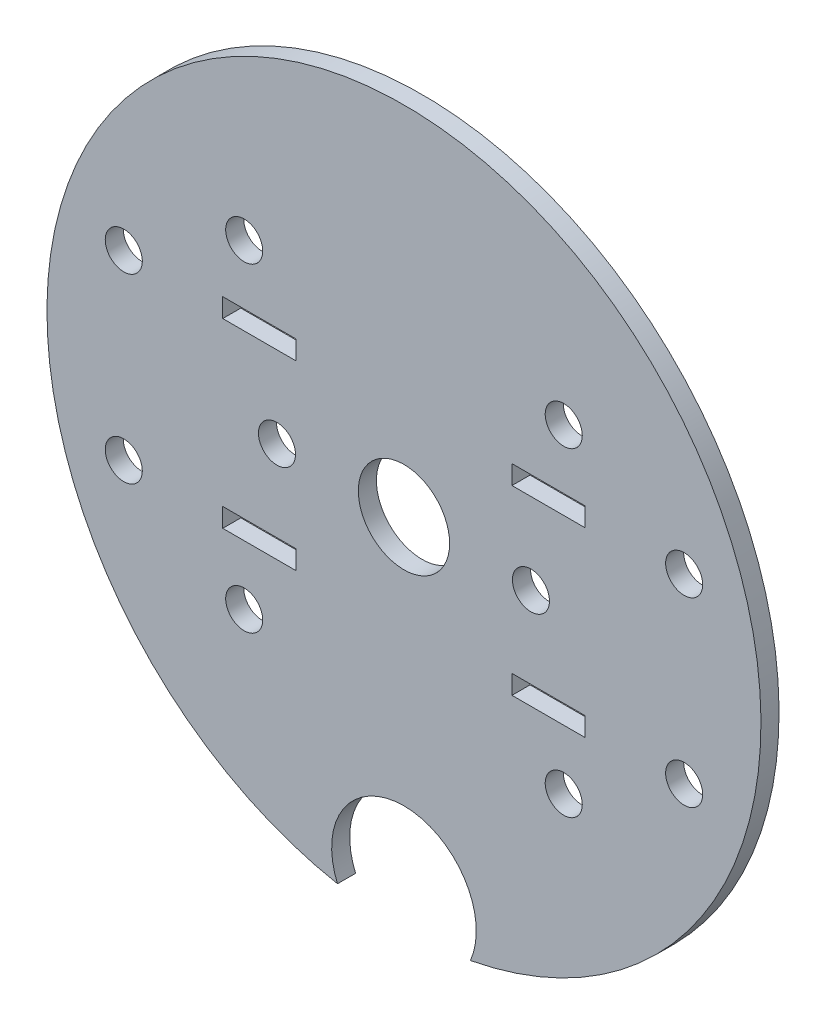
ISO-10303-21;
HEADER;
FILE_DESCRIPTION(('STEP AP214'),'2;1');
FILE_NAME('part.step','',(''),(''),'','','');
FILE_SCHEMA(('AUTOMOTIVE_DESIGN { 1 0 10303 214 1 1 1 1 }'));
ENDSEC;
DATA;
#1=APPLICATION_CONTEXT('core data for automotive mechanical design processes');
#2=APPLICATION_PROTOCOL_DEFINITION('international standard','automotive_design',2000,#1);
#3=PRODUCT_CONTEXT('',#1,'mechanical');
#4=PRODUCT('Part','Part','',(#3));
#5=PRODUCT_RELATED_PRODUCT_CATEGORY('part','',(#4));
#6=PRODUCT_DEFINITION_FORMATION('','',#4);
#7=PRODUCT_DEFINITION_CONTEXT('part definition',#1,'design');
#8=PRODUCT_DEFINITION('design','',#6,#7);
#9=PRODUCT_DEFINITION_SHAPE('','',#8);
#10=(LENGTH_UNIT() NAMED_UNIT(*) SI_UNIT(.MILLI.,.METRE.));
#11=(NAMED_UNIT(*) PLANE_ANGLE_UNIT() SI_UNIT($,.RADIAN.));
#12=(NAMED_UNIT(*) SI_UNIT($,.STERADIAN.) SOLID_ANGLE_UNIT());
#13=UNCERTAINTY_MEASURE_WITH_UNIT(LENGTH_MEASURE(1.E-05),#10,'distance_accuracy_value','');
#14=(GEOMETRIC_REPRESENTATION_CONTEXT(3) GLOBAL_UNCERTAINTY_ASSIGNED_CONTEXT((#13)) GLOBAL_UNIT_ASSIGNED_CONTEXT((#10,
#11,#12)) REPRESENTATION_CONTEXT('',''));
#15=CARTESIAN_POINT('',(0.,0.,0.));
#16=DIRECTION('',(0.,0.,1.));
#17=DIRECTION('',(1.,0.,0.));
#18=AXIS2_PLACEMENT_3D('',#15,#16,#17);
#19=CARTESIAN_POINT('',(0.,-17.8310405714632,2.));
#20=DIRECTION('',(0.,0.,-1.));
#21=DIRECTION('',(-1.,0.,0.));
#22=AXIS2_PLACEMENT_3D('',#19,#20,#21);
#23=PLANE('',#22);
#24=DIRECTION('',(-1.,0.,0.));
#25=VECTOR('',#24,1.);
#26=CARTESIAN_POINT('',(-11.95,11.1,2.));
#27=LINE('',#26,#25);
#28=CARTESIAN_POINT('',(-11.95,11.1,2.));
#29=VERTEX_POINT('',#28);
#30=CARTESIAN_POINT('',(-20.05,11.1,2.));
#31=VERTEX_POINT('',#30);
#32=EDGE_CURVE('E199',#29,#31,#27,.T.);
#33=ORIENTED_EDGE('',*,*,#32,.F.);
#34=DIRECTION('',(0.,1.,0.));
#35=VECTOR('',#34,1.);
#36=CARTESIAN_POINT('',(-11.95,11.1,2.));
#37=LINE('',#36,#35);
#38=CARTESIAN_POINT('',(-11.95,9.,2.));
#39=VERTEX_POINT('',#38);
#40=EDGE_CURVE('E207',#39,#29,#37,.T.);
#41=ORIENTED_EDGE('',*,*,#40,.F.);
#42=DIRECTION('',(1.,0.,0.));
#43=VECTOR('',#42,1.);
#44=CARTESIAN_POINT('',(-11.95,9.,2.));
#45=LINE('',#44,#43);
#46=CARTESIAN_POINT('',(-20.05,9.,2.));
#47=VERTEX_POINT('',#46);
#48=EDGE_CURVE('E204',#47,#39,#45,.T.);
#49=ORIENTED_EDGE('',*,*,#48,.F.);
#50=DIRECTION('',(0.,-1.,0.));
#51=VECTOR('',#50,1.);
#52=CARTESIAN_POINT('',(-20.05,11.1,2.));
#53=LINE('',#52,#51);
#54=EDGE_CURVE('E201',#31,#47,#53,.T.);
#55=ORIENTED_EDGE('',*,*,#54,.F.);
#56=EDGE_LOOP('',(#33,#41,#49,#55));
#57=FACE_BOUND('',#56,.T.);
#58=CARTESIAN_POINT('',(-17.6776695296637,-17.6776695296637,2.));
#59=DIRECTION('',(0.,0.,1.));
#60=DIRECTION('',(1.,0.,0.));
#61=AXIS2_PLACEMENT_3D('',#58,#59,#60);
#62=CIRCLE('',#61,2.05);
#63=CARTESIAN_POINT('',(-15.6276695296637,-17.6776695296637,2.));
#64=VERTEX_POINT('',#63);
#65=EDGE_CURVE('E279',#64,#64,#62,.T.);
#66=ORIENTED_EDGE('',*,*,#65,.F.);
#67=EDGE_LOOP('',(#66));
#68=FACE_BOUND('',#67,.T.);
#69=CARTESIAN_POINT('',(0.,0.,2.));
#70=DIRECTION('',(0.,0.,1.));
#71=DIRECTION('',(1.,0.,0.));
#72=AXIS2_PLACEMENT_3D('',#69,#70,#71);
#73=CIRCLE('',#72,5.05);
#74=CARTESIAN_POINT('',(5.05,0.,2.));
#75=VERTEX_POINT('',#74);
#76=EDGE_CURVE('E285',#75,#75,#73,.T.);
#77=ORIENTED_EDGE('',*,*,#76,.F.);
#78=EDGE_LOOP('',(#77));
#79=FACE_BOUND('',#78,.T.);
#80=DIRECTION('',(1.,0.,0.));
#81=VECTOR('',#80,1.);
#82=CARTESIAN_POINT('',(11.95,-11.1,2.));
#83=LINE('',#82,#81);
#84=CARTESIAN_POINT('',(11.95,-11.1,2.));
#85=VERTEX_POINT('',#84);
#86=CARTESIAN_POINT('',(20.05,-11.1,2.));
#87=VERTEX_POINT('',#86);
#88=EDGE_CURVE('E291',#85,#87,#83,.T.);
#89=ORIENTED_EDGE('',*,*,#88,.F.);
#90=DIRECTION('',(0.,-1.,0.));
#91=VECTOR('',#90,1.);
#92=CARTESIAN_POINT('',(11.95,-11.1,2.));
#93=LINE('',#92,#91);
#94=CARTESIAN_POINT('',(11.95,-9.,2.));
#95=VERTEX_POINT('',#94);
#96=EDGE_CURVE('E299',#95,#85,#93,.T.);
#97=ORIENTED_EDGE('',*,*,#96,.F.);
#98=DIRECTION('',(-1.,0.,0.));
#99=VECTOR('',#98,1.);
#100=CARTESIAN_POINT('',(11.95,-9.,2.));
#101=LINE('',#100,#99);
#102=CARTESIAN_POINT('',(20.05,-9.,2.));
#103=VERTEX_POINT('',#102);
#104=EDGE_CURVE('E296',#103,#95,#101,.T.);
#105=ORIENTED_EDGE('',*,*,#104,.F.);
#106=DIRECTION('',(0.,1.,0.));
#107=VECTOR('',#106,1.);
#108=CARTESIAN_POINT('',(20.05,-11.1,2.));
#109=LINE('',#108,#107);
#110=EDGE_CURVE('E293',#87,#103,#109,.T.);
#111=ORIENTED_EDGE('',*,*,#110,.F.);
#112=EDGE_LOOP('',(#89,#97,#105,#111));
#113=FACE_BOUND('',#112,.T.);
#114=CARTESIAN_POINT('',(0.,-35.6620811429264,2.));
#115=DIRECTION('',(0.,0.,-1.));
#116=DIRECTION('',(-1.,0.,0.));
#117=AXIS2_PLACEMENT_3D('',#114,#115,#116);
#118=CIRCLE('',#117,8.);
#119=CARTESIAN_POINT('',(-7.35497190989704,-38.8092049416711,2.));
#120=VERTEX_POINT('',#119);
#121=CARTESIAN_POINT('',(7.35497190989709,-38.8092049416711,2.));
#122=VERTEX_POINT('',#121);
#123=EDGE_CURVE('E322',#120,#122,#118,.T.);
#124=ORIENTED_EDGE('',*,*,#123,.T.);
#125=CARTESIAN_POINT('',(0.,0.,2.));
#126=DIRECTION('',(0.,0.,1.));
#127=DIRECTION('',(-1.,0.,0.));
#128=AXIS2_PLACEMENT_3D('',#125,#126,#127);
#129=CIRCLE('',#128,39.5);
#130=EDGE_CURVE('E325',#122,#120,#129,.T.);
#131=ORIENTED_EDGE('',*,*,#130,.T.);
#132=EDGE_LOOP('',(#124,#131));
#133=FACE_BOUND('',#132,.T.);
#134=DIRECTION('',(0.,1.,0.));
#135=VECTOR('',#134,1.);
#136=CARTESIAN_POINT('',(20.05,11.1,2.));
#137=LINE('',#136,#135);
#138=CARTESIAN_POINT('',(20.05,9.,2.));
#139=VERTEX_POINT('',#138);
#140=CARTESIAN_POINT('',(20.05,11.1,2.));
#141=VERTEX_POINT('',#140);
#142=EDGE_CURVE('E248',#139,#141,#137,.T.);
#143=ORIENTED_EDGE('',*,*,#142,.F.);
#144=DIRECTION('',(1.,0.,0.));
#145=VECTOR('',#144,1.);
#146=CARTESIAN_POINT('',(11.95,9.,2.));
#147=LINE('',#146,#145);
#148=CARTESIAN_POINT('',(11.95,9.,2.));
#149=VERTEX_POINT('',#148);
#150=EDGE_CURVE('E256',#149,#139,#147,.T.);
#151=ORIENTED_EDGE('',*,*,#150,.F.);
#152=DIRECTION('',(0.,-1.,0.));
#153=VECTOR('',#152,1.);
#154=CARTESIAN_POINT('',(11.95,11.1,2.));
#155=LINE('',#154,#153);
#156=CARTESIAN_POINT('',(11.95,11.1,2.));
#157=VERTEX_POINT('',#156);
#158=EDGE_CURVE('E253',#157,#149,#155,.T.);
#159=ORIENTED_EDGE('',*,*,#158,.F.);
#160=DIRECTION('',(-1.,0.,0.));
#161=VECTOR('',#160,1.);
#162=CARTESIAN_POINT('',(11.95,11.1,2.));
#163=LINE('',#162,#161);
#164=EDGE_CURVE('E250',#141,#157,#163,.T.);
#165=ORIENTED_EDGE('',*,*,#164,.F.);
#166=EDGE_LOOP('',(#143,#151,#159,#165));
#167=FACE_BOUND('',#166,.T.);
#168=CARTESIAN_POINT('',(-17.6776695296637,17.6776695296637,2.));
#169=DIRECTION('',(0.,0.,1.));
#170=DIRECTION('',(1.,0.,0.));
#171=AXIS2_PLACEMENT_3D('',#168,#169,#170);
#172=CIRCLE('',#171,2.05);
#173=CARTESIAN_POINT('',(-15.6276695296637,17.6776695296637,2.));
#174=VERTEX_POINT('',#173);
#175=EDGE_CURVE('E242',#174,#174,#172,.T.);
#176=ORIENTED_EDGE('',*,*,#175,.F.);
#177=EDGE_LOOP('',(#176));
#178=FACE_BOUND('',#177,.T.);
#179=CARTESIAN_POINT('',(17.6776695296637,17.6776695296637,2.));
#180=DIRECTION('',(0.,0.,1.));
#181=DIRECTION('',(1.,0.,0.));
#182=AXIS2_PLACEMENT_3D('',#179,#180,#181);
#183=CIRCLE('',#182,2.05);
#184=CARTESIAN_POINT('',(19.7276695296637,17.6776695296637,2.));
#185=VERTEX_POINT('',#184);
#186=EDGE_CURVE('E236',#185,#185,#183,.T.);
#187=ORIENTED_EDGE('',*,*,#186,.F.);
#188=EDGE_LOOP('',(#187));
#189=FACE_BOUND('',#188,.T.);
#190=CARTESIAN_POINT('',(17.6776695296637,-17.6776695296637,2.));
#191=DIRECTION('',(0.,0.,1.));
#192=DIRECTION('',(1.,0.,0.));
#193=AXIS2_PLACEMENT_3D('',#190,#191,#192);
#194=CIRCLE('',#193,2.05);
#195=CARTESIAN_POINT('',(19.7276695296637,-17.6776695296637,2.));
#196=VERTEX_POINT('',#195);
#197=EDGE_CURVE('E230',#196,#196,#194,.T.);
#198=ORIENTED_EDGE('',*,*,#197,.F.);
#199=EDGE_LOOP('',(#198));
#200=FACE_BOUND('',#199,.T.);
#201=DIRECTION('',(1.,0.,0.));
#202=VECTOR('',#201,1.);
#203=CARTESIAN_POINT('',(-11.95,-11.1,2.));
#204=LINE('',#203,#202);
#205=CARTESIAN_POINT('',(-20.05,-11.1,2.));
#206=VERTEX_POINT('',#205);
#207=CARTESIAN_POINT('',(-11.95,-11.1,2.));
#208=VERTEX_POINT('',#207);
#209=EDGE_CURVE('E160',#206,#208,#204,.T.);
#210=ORIENTED_EDGE('',*,*,#209,.F.);
#211=DIRECTION('',(0.,-1.,0.));
#212=VECTOR('',#211,1.);
#213=CARTESIAN_POINT('',(-20.05,-11.1,2.));
#214=LINE('',#213,#212);
#215=CARTESIAN_POINT('',(-20.05,-9.,2.));
#216=VERTEX_POINT('',#215);
#217=EDGE_CURVE('E183',#216,#206,#214,.T.);
#218=ORIENTED_EDGE('',*,*,#217,.F.);
#219=DIRECTION('',(-1.,0.,0.));
#220=VECTOR('',#219,1.);
#221=CARTESIAN_POINT('',(-11.95,-9.,2.));
#222=LINE('',#221,#220);
#223=CARTESIAN_POINT('',(-11.95,-9.,2.));
#224=VERTEX_POINT('',#223);
#225=EDGE_CURVE('E181',#224,#216,#222,.T.);
#226=ORIENTED_EDGE('',*,*,#225,.F.);
#227=DIRECTION('',(0.,1.,0.));
#228=VECTOR('',#227,1.);
#229=CARTESIAN_POINT('',(-11.95,-11.1,2.));
#230=LINE('',#229,#228);
#231=EDGE_CURVE('E168',#208,#224,#230,.T.);
#232=ORIENTED_EDGE('',*,*,#231,.F.);
#233=EDGE_LOOP('',(#210,#218,#226,#232));
#234=FACE_BOUND('',#233,.T.);
#235=CARTESIAN_POINT('',(31.,10.05,2.));
#236=DIRECTION('',(0.,0.,1.));
#237=DIRECTION('',(1.,0.,0.));
#238=AXIS2_PLACEMENT_3D('',#235,#236,#237);
#239=CIRCLE('',#238,2.04999999999999);
#240=CARTESIAN_POINT('',(33.05,10.05,2.));
#241=VERTEX_POINT('',#240);
#242=EDGE_CURVE('E189',#241,#241,#239,.T.);
#243=ORIENTED_EDGE('',*,*,#242,.F.);
#244=EDGE_LOOP('',(#243));
#245=FACE_BOUND('',#244,.T.);
#246=CARTESIAN_POINT('',(31.,-10.05,2.));
#247=DIRECTION('',(0.,0.,1.));
#248=DIRECTION('',(-1.,0.,0.));
#249=AXIS2_PLACEMENT_3D('',#246,#247,#248);
#250=CIRCLE('',#249,2.04999999999999);
#251=CARTESIAN_POINT('',(28.95,-10.05,2.));
#252=VERTEX_POINT('',#251);
#253=EDGE_CURVE('E404',#252,#252,#250,.T.);
#254=ORIENTED_EDGE('',*,*,#253,.F.);
#255=EDGE_LOOP('',(#254));
#256=FACE_BOUND('',#255,.T.);
#257=CARTESIAN_POINT('',(-31.,-10.05,2.));
#258=DIRECTION('',(0.,0.,1.));
#259=DIRECTION('',(1.,0.,0.));
#260=AXIS2_PLACEMENT_3D('',#257,#258,#259);
#261=CIRCLE('',#260,2.04999999999999);
#262=CARTESIAN_POINT('',(-28.95,-10.05,2.));
#263=VERTEX_POINT('',#262);
#264=EDGE_CURVE('E399',#263,#263,#261,.T.);
#265=ORIENTED_EDGE('',*,*,#264,.F.);
#266=EDGE_LOOP('',(#265));
#267=FACE_BOUND('',#266,.T.);
#268=CARTESIAN_POINT('',(-31.,10.05,2.));
#269=DIRECTION('',(0.,0.,1.));
#270=DIRECTION('',(-1.,0.,0.));
#271=AXIS2_PLACEMENT_3D('',#268,#269,#270);
#272=CIRCLE('',#271,2.04999999999999);
#273=CARTESIAN_POINT('',(-33.05,10.05,2.));
#274=VERTEX_POINT('',#273);
#275=EDGE_CURVE('E394',#274,#274,#272,.T.);
#276=ORIENTED_EDGE('',*,*,#275,.F.);
#277=EDGE_LOOP('',(#276));
#278=FACE_BOUND('',#277,.T.);
#279=CARTESIAN_POINT('',(-14.05,0.,2.));
#280=DIRECTION('',(0.,0.,1.));
#281=DIRECTION('',(1.,0.,0.));
#282=AXIS2_PLACEMENT_3D('',#279,#280,#281);
#283=CIRCLE('',#282,2.05);
#284=CARTESIAN_POINT('',(-12.,0.,2.));
#285=VERTEX_POINT('',#284);
#286=EDGE_CURVE('E389',#285,#285,#283,.T.);
#287=ORIENTED_EDGE('',*,*,#286,.F.);
#288=EDGE_LOOP('',(#287));
#289=FACE_BOUND('',#288,.T.);
#290=CARTESIAN_POINT('',(14.05,0.,2.));
#291=DIRECTION('',(0.,0.,1.));
#292=DIRECTION('',(-1.,0.,0.));
#293=AXIS2_PLACEMENT_3D('',#290,#291,#292);
#294=CIRCLE('',#293,2.05);
#295=CARTESIAN_POINT('',(12.,0.,2.));
#296=VERTEX_POINT('',#295);
#297=EDGE_CURVE('E383',#296,#296,#294,.T.);
#298=ORIENTED_EDGE('',*,*,#297,.F.);
#299=EDGE_LOOP('',(#298));
#300=FACE_BOUND('',#299,.T.);
#301=ADVANCED_FACE('F35',(#57,#68,#79,#113,#133,#167,#178,#189,#200,#234,#245,#256,#267,#278,
#289,#300),#23,.F.);
#302=CARTESIAN_POINT('',(0.,-17.8310405714632,0.));
#303=DIRECTION('',(0.,0.,-1.));
#304=DIRECTION('',(-1.,0.,0.));
#305=AXIS2_PLACEMENT_3D('',#302,#303,#304);
#306=PLANE('',#305);
#307=CARTESIAN_POINT('',(-14.05,0.,0.));
#308=DIRECTION('',(0.,0.,1.));
#309=DIRECTION('',(1.,0.,0.));
#310=AXIS2_PLACEMENT_3D('',#307,#308,#309);
#311=CIRCLE('',#310,2.05);
#312=CARTESIAN_POINT('',(-12.,0.,0.));
#313=VERTEX_POINT('',#312);
#314=EDGE_CURVE('E386',#313,#313,#311,.T.);
#315=ORIENTED_EDGE('',*,*,#314,.T.);
#316=EDGE_LOOP('',(#315));
#317=FACE_BOUND('',#316,.T.);
#318=CARTESIAN_POINT('',(-31.,-10.05,0.));
#319=DIRECTION('',(0.,0.,1.));
#320=DIRECTION('',(1.,0.,0.));
#321=AXIS2_PLACEMENT_3D('',#318,#319,#320);
#322=CIRCLE('',#321,2.04999999999999);
#323=CARTESIAN_POINT('',(-28.95,-10.05,0.));
#324=VERTEX_POINT('',#323);
#325=EDGE_CURVE('E397',#324,#324,#322,.T.);
#326=ORIENTED_EDGE('',*,*,#325,.T.);
#327=EDGE_LOOP('',(#326));
#328=FACE_BOUND('',#327,.T.);
#329=CARTESIAN_POINT('',(31.,10.05,0.));
#330=DIRECTION('',(0.,0.,1.));
#331=DIRECTION('',(1.,0.,0.));
#332=AXIS2_PLACEMENT_3D('',#329,#330,#331);
#333=CIRCLE('',#332,2.04999999999999);
#334=CARTESIAN_POINT('',(33.05,10.05,0.));
#335=VERTEX_POINT('',#334);
#336=EDGE_CURVE('E407',#335,#335,#333,.T.);
#337=ORIENTED_EDGE('',*,*,#336,.T.);
#338=EDGE_LOOP('',(#337));
#339=FACE_BOUND('',#338,.T.);
#340=CARTESIAN_POINT('',(17.6776695296637,17.6776695296637,0.));
#341=DIRECTION('',(0.,0.,1.));
#342=DIRECTION('',(1.,0.,0.));
#343=AXIS2_PLACEMENT_3D('',#340,#341,#342);
#344=CIRCLE('',#343,2.05);
#345=CARTESIAN_POINT('',(19.7276695296637,17.6776695296637,0.));
#346=VERTEX_POINT('',#345);
#347=EDGE_CURVE('E233',#346,#346,#344,.T.);
#348=ORIENTED_EDGE('',*,*,#347,.T.);
#349=EDGE_LOOP('',(#348));
#350=FACE_BOUND('',#349,.T.);
#351=DIRECTION('',(1.,0.,0.));
#352=VECTOR('',#351,1.);
#353=CARTESIAN_POINT('',(11.95,9.,0.));
#354=LINE('',#353,#352);
#355=CARTESIAN_POINT('',(11.95,9.,0.));
#356=VERTEX_POINT('',#355);
#357=CARTESIAN_POINT('',(20.05,9.,0.));
#358=VERTEX_POINT('',#357);
#359=EDGE_CURVE('E251',#356,#358,#354,.T.);
#360=ORIENTED_EDGE('',*,*,#359,.T.);
#361=DIRECTION('',(0.,1.,0.));
#362=VECTOR('',#361,1.);
#363=CARTESIAN_POINT('',(20.05,11.1,0.));
#364=LINE('',#363,#362);
#365=CARTESIAN_POINT('',(20.05,11.1,0.));
#366=VERTEX_POINT('',#365);
#367=EDGE_CURVE('E245',#358,#366,#364,.T.);
#368=ORIENTED_EDGE('',*,*,#367,.T.);
#369=DIRECTION('',(-1.,0.,0.));
#370=VECTOR('',#369,1.);
#371=CARTESIAN_POINT('',(11.95,11.1,0.));
#372=LINE('',#371,#370);
#373=CARTESIAN_POINT('',(11.95,11.1,0.));
#374=VERTEX_POINT('',#373);
#375=EDGE_CURVE('E261',#366,#374,#372,.T.);
#376=ORIENTED_EDGE('',*,*,#375,.T.);
#377=DIRECTION('',(0.,-1.,0.));
#378=VECTOR('',#377,1.);
#379=CARTESIAN_POINT('',(11.95,11.1,0.));
#380=LINE('',#379,#378);
#381=EDGE_CURVE('E264',#374,#356,#380,.T.);
#382=ORIENTED_EDGE('',*,*,#381,.T.);
#383=EDGE_LOOP('',(#360,#368,#376,#382));
#384=FACE_BOUND('',#383,.T.);
#385=CARTESIAN_POINT('',(-17.6776695296637,-17.6776695296637,0.));
#386=DIRECTION('',(0.,0.,1.));
#387=DIRECTION('',(1.,0.,0.));
#388=AXIS2_PLACEMENT_3D('',#385,#386,#387);
#389=CIRCLE('',#388,2.05);
#390=CARTESIAN_POINT('',(-15.6276695296637,-17.6776695296637,0.));
#391=VERTEX_POINT('',#390);
#392=EDGE_CURVE('E278',#391,#391,#389,.T.);
#393=ORIENTED_EDGE('',*,*,#392,.T.);
#394=EDGE_LOOP('',(#393));
#395=FACE_BOUND('',#394,.T.);
#396=DIRECTION('',(0.,-1.,0.));
#397=VECTOR('',#396,1.);
#398=CARTESIAN_POINT('',(11.95,-11.1,0.));
#399=LINE('',#398,#397);
#400=CARTESIAN_POINT('',(11.95,-9.,0.));
#401=VERTEX_POINT('',#400);
#402=CARTESIAN_POINT('',(11.95,-11.1,0.));
#403=VERTEX_POINT('',#402);
#404=EDGE_CURVE('E294',#401,#403,#399,.T.);
#405=ORIENTED_EDGE('',*,*,#404,.T.);
#406=DIRECTION('',(1.,0.,0.));
#407=VECTOR('',#406,1.);
#408=CARTESIAN_POINT('',(11.95,-11.1,0.));
#409=LINE('',#408,#407);
#410=CARTESIAN_POINT('',(20.05,-11.1,0.));
#411=VERTEX_POINT('',#410);
#412=EDGE_CURVE('E288',#403,#411,#409,.T.);
#413=ORIENTED_EDGE('',*,*,#412,.T.);
#414=DIRECTION('',(0.,1.,0.));
#415=VECTOR('',#414,1.);
#416=CARTESIAN_POINT('',(20.05,-11.1,0.));
#417=LINE('',#416,#415);
#418=CARTESIAN_POINT('',(20.05,-9.,0.));
#419=VERTEX_POINT('',#418);
#420=EDGE_CURVE('E304',#411,#419,#417,.T.);
#421=ORIENTED_EDGE('',*,*,#420,.T.);
#422=DIRECTION('',(-1.,0.,0.));
#423=VECTOR('',#422,1.);
#424=CARTESIAN_POINT('',(11.95,-9.,0.));
#425=LINE('',#424,#423);
#426=EDGE_CURVE('E307',#419,#401,#425,.T.);
#427=ORIENTED_EDGE('',*,*,#426,.T.);
#428=EDGE_LOOP('',(#405,#413,#421,#427));
#429=FACE_BOUND('',#428,.T.);
#430=CARTESIAN_POINT('',(0.,-35.6620811429264,0.));
#431=DIRECTION('',(0.,0.,-1.));
#432=DIRECTION('',(-1.,0.,0.));
#433=AXIS2_PLACEMENT_3D('',#430,#431,#432);
#434=CIRCLE('',#433,8.);
#435=CARTESIAN_POINT('',(-7.35497190989704,-38.8092049416711,0.));
#436=VERTEX_POINT('',#435);
#437=CARTESIAN_POINT('',(7.35497190989709,-38.8092049416711,0.));
#438=VERTEX_POINT('',#437);
#439=EDGE_CURVE('E321',#436,#438,#434,.T.);
#440=ORIENTED_EDGE('',*,*,#439,.F.);
#441=CARTESIAN_POINT('',(0.,0.,0.));
#442=DIRECTION('',(0.,0.,1.));
#443=DIRECTION('',(-1.,0.,0.));
#444=AXIS2_PLACEMENT_3D('',#441,#442,#443);
#445=CIRCLE('',#444,39.5);
#446=EDGE_CURVE('E326',#438,#436,#445,.T.);
#447=ORIENTED_EDGE('',*,*,#446,.F.);
#448=EDGE_LOOP('',(#440,#447));
#449=FACE_BOUND('',#448,.T.);
#450=CARTESIAN_POINT('',(0.,0.,0.));
#451=DIRECTION('',(0.,0.,1.));
#452=DIRECTION('',(1.,0.,0.));
#453=AXIS2_PLACEMENT_3D('',#450,#451,#452);
#454=CIRCLE('',#453,5.05);
#455=CARTESIAN_POINT('',(5.05,0.,0.));
#456=VERTEX_POINT('',#455);
#457=EDGE_CURVE('E282',#456,#456,#454,.T.);
#458=ORIENTED_EDGE('',*,*,#457,.T.);
#459=EDGE_LOOP('',(#458));
#460=FACE_BOUND('',#459,.T.);
#461=CARTESIAN_POINT('',(-17.6776695296637,17.6776695296637,0.));
#462=DIRECTION('',(0.,0.,1.));
#463=DIRECTION('',(1.,0.,0.));
#464=AXIS2_PLACEMENT_3D('',#461,#462,#463);
#465=CIRCLE('',#464,2.05);
#466=CARTESIAN_POINT('',(-15.6276695296637,17.6776695296637,0.));
#467=VERTEX_POINT('',#466);
#468=EDGE_CURVE('E239',#467,#467,#465,.T.);
#469=ORIENTED_EDGE('',*,*,#468,.T.);
#470=EDGE_LOOP('',(#469));
#471=FACE_BOUND('',#470,.T.);
#472=CARTESIAN_POINT('',(17.6776695296637,-17.6776695296637,0.));
#473=DIRECTION('',(0.,0.,1.));
#474=DIRECTION('',(1.,0.,0.));
#475=AXIS2_PLACEMENT_3D('',#472,#473,#474);
#476=CIRCLE('',#475,2.05);
#477=CARTESIAN_POINT('',(19.7276695296637,-17.6776695296637,0.));
#478=VERTEX_POINT('',#477);
#479=EDGE_CURVE('E229',#478,#478,#476,.T.);
#480=ORIENTED_EDGE('',*,*,#479,.T.);
#481=EDGE_LOOP('',(#480));
#482=FACE_BOUND('',#481,.T.);
#483=DIRECTION('',(0.,1.,0.));
#484=VECTOR('',#483,1.);
#485=CARTESIAN_POINT('',(-11.95,11.1,0.));
#486=LINE('',#485,#484);
#487=CARTESIAN_POINT('',(-11.95,9.,0.));
#488=VERTEX_POINT('',#487);
#489=CARTESIAN_POINT('',(-11.95,11.1,0.));
#490=VERTEX_POINT('',#489);
#491=EDGE_CURVE('E202',#488,#490,#486,.T.);
#492=ORIENTED_EDGE('',*,*,#491,.T.);
#493=DIRECTION('',(-1.,0.,0.));
#494=VECTOR('',#493,1.);
#495=CARTESIAN_POINT('',(-11.95,11.1,0.));
#496=LINE('',#495,#494);
#497=CARTESIAN_POINT('',(-20.05,11.1,0.));
#498=VERTEX_POINT('',#497);
#499=EDGE_CURVE('E176',#490,#498,#496,.T.);
#500=ORIENTED_EDGE('',*,*,#499,.T.);
#501=DIRECTION('',(0.,-1.,0.));
#502=VECTOR('',#501,1.);
#503=CARTESIAN_POINT('',(-20.05,11.1,0.));
#504=LINE('',#503,#502);
#505=CARTESIAN_POINT('',(-20.05,9.,0.));
#506=VERTEX_POINT('',#505);
#507=EDGE_CURVE('E212',#498,#506,#504,.T.);
#508=ORIENTED_EDGE('',*,*,#507,.T.);
#509=DIRECTION('',(1.,0.,0.));
#510=VECTOR('',#509,1.);
#511=CARTESIAN_POINT('',(-11.95,9.,0.));
#512=LINE('',#511,#510);
#513=EDGE_CURVE('E215',#506,#488,#512,.T.);
#514=ORIENTED_EDGE('',*,*,#513,.T.);
#515=EDGE_LOOP('',(#492,#500,#508,#514));
#516=FACE_BOUND('',#515,.T.);
#517=DIRECTION('',(0.,-1.,0.));
#518=VECTOR('',#517,1.);
#519=CARTESIAN_POINT('',(-20.05,-11.1,0.));
#520=LINE('',#519,#518);
#521=CARTESIAN_POINT('',(-20.05,-9.,0.));
#522=VERTEX_POINT('',#521);
#523=CARTESIAN_POINT('',(-20.05,-11.1,0.));
#524=VERTEX_POINT('',#523);
#525=EDGE_CURVE('E169',#522,#524,#520,.T.);
#526=ORIENTED_EDGE('',*,*,#525,.T.);
#527=DIRECTION('',(1.,0.,0.));
#528=VECTOR('',#527,1.);
#529=CARTESIAN_POINT('',(-11.95,-11.1,0.));
#530=LINE('',#529,#528);
#531=CARTESIAN_POINT('',(-11.95,-11.1,0.));
#532=VERTEX_POINT('',#531);
#533=EDGE_CURVE('E58',#524,#532,#530,.T.);
#534=ORIENTED_EDGE('',*,*,#533,.T.);
#535=DIRECTION('',(0.,1.,0.));
#536=VECTOR('',#535,1.);
#537=CARTESIAN_POINT('',(-11.95,-11.1,0.));
#538=LINE('',#537,#536);
#539=CARTESIAN_POINT('',(-11.95,-9.,0.));
#540=VERTEX_POINT('',#539);
#541=EDGE_CURVE('E175',#532,#540,#538,.T.);
#542=ORIENTED_EDGE('',*,*,#541,.T.);
#543=DIRECTION('',(-1.,0.,0.));
#544=VECTOR('',#543,1.);
#545=CARTESIAN_POINT('',(-11.95,-9.,0.));
#546=LINE('',#545,#544);
#547=EDGE_CURVE('E191',#540,#522,#546,.T.);
#548=ORIENTED_EDGE('',*,*,#547,.T.);
#549=EDGE_LOOP('',(#526,#534,#542,#548));
#550=FACE_BOUND('',#549,.T.);
#551=CARTESIAN_POINT('',(31.,-10.05,0.));
#552=DIRECTION('',(0.,0.,1.));
#553=DIRECTION('',(-1.,0.,0.));
#554=AXIS2_PLACEMENT_3D('',#551,#552,#553);
#555=CIRCLE('',#554,2.04999999999999);
#556=CARTESIAN_POINT('',(28.95,-10.05,0.));
#557=VERTEX_POINT('',#556);
#558=EDGE_CURVE('E374',#557,#557,#555,.T.);
#559=ORIENTED_EDGE('',*,*,#558,.T.);
#560=EDGE_LOOP('',(#559));
#561=FACE_BOUND('',#560,.T.);
#562=CARTESIAN_POINT('',(-31.,10.05,0.));
#563=DIRECTION('',(0.,0.,1.));
#564=DIRECTION('',(-1.,0.,0.));
#565=AXIS2_PLACEMENT_3D('',#562,#563,#564);
#566=CIRCLE('',#565,2.04999999999999);
#567=CARTESIAN_POINT('',(-33.05,10.05,0.));
#568=VERTEX_POINT('',#567);
#569=EDGE_CURVE('E378',#568,#568,#566,.T.);
#570=ORIENTED_EDGE('',*,*,#569,.T.);
#571=EDGE_LOOP('',(#570));
#572=FACE_BOUND('',#571,.T.);
#573=CARTESIAN_POINT('',(14.05,0.,0.));
#574=DIRECTION('',(0.,0.,1.));
#575=DIRECTION('',(-1.,0.,0.));
#576=AXIS2_PLACEMENT_3D('',#573,#574,#575);
#577=CIRCLE('',#576,2.05);
#578=CARTESIAN_POINT('',(12.,0.,0.));
#579=VERTEX_POINT('',#578);
#580=EDGE_CURVE('E381',#579,#579,#577,.T.);
#581=ORIENTED_EDGE('',*,*,#580,.T.);
#582=EDGE_LOOP('',(#581));
#583=FACE_BOUND('',#582,.T.);
#584=ADVANCED_FACE('F338',(#317,#328,#339,#350,#384,#395,#429,#449,#460,#471,#482,#516,#550,
#561,#572,#583),#306,.T.);
#585=CARTESIAN_POINT('',(0.,-35.6620811429264,2.));
#586=DIRECTION('',(0.,0.,-1.));
#587=DIRECTION('',(-1.,0.,0.));
#588=AXIS2_PLACEMENT_3D('',#585,#586,#587);
#589=CYLINDRICAL_SURFACE('',#588,8.);
#590=ORIENTED_EDGE('',*,*,#439,.T.);
#591=DIRECTION('',(0.,0.,-1.));
#592=VECTOR('',#591,1.);
#593=CARTESIAN_POINT('',(7.35497190989709,-38.8092049416711,2.));
#594=LINE('',#593,#592);
#595=EDGE_CURVE('E11',#122,#438,#594,.T.);
#596=ORIENTED_EDGE('',*,*,#595,.F.);
#597=ORIENTED_EDGE('',*,*,#123,.F.);
#598=DIRECTION('',(0.,0.,-1.));
#599=VECTOR('',#598,1.);
#600=CARTESIAN_POINT('',(-7.35497190989704,-38.8092049416711,2.));
#601=LINE('',#600,#599);
#602=EDGE_CURVE('E43',#120,#436,#601,.T.);
#603=ORIENTED_EDGE('',*,*,#602,.T.);
#604=EDGE_LOOP('',(#590,#596,#597,#603));
#605=FACE_BOUND('',#604,.T.);
#606=ADVANCED_FACE('F37',(#605),#589,.F.);
#607=CARTESIAN_POINT('',(0.,0.,2.));
#608=DIRECTION('',(0.,0.,-1.));
#609=DIRECTION('',(-1.,0.,0.));
#610=AXIS2_PLACEMENT_3D('',#607,#608,#609);
#611=CYLINDRICAL_SURFACE('',#610,39.5);
#612=ORIENTED_EDGE('',*,*,#446,.T.);
#613=ORIENTED_EDGE('',*,*,#602,.F.);
#614=ORIENTED_EDGE('',*,*,#130,.F.);
#615=ORIENTED_EDGE('',*,*,#595,.T.);
#616=EDGE_LOOP('',(#612,#613,#614,#615));
#617=FACE_BOUND('',#616,.T.);
#618=ADVANCED_FACE('F340',(#617),#611,.T.);
#619=CARTESIAN_POINT('',(11.95,-11.1,2.));
#620=DIRECTION('',(0.,1.,0.));
#621=DIRECTION('',(0.,0.,1.));
#622=AXIS2_PLACEMENT_3D('',#619,#620,#621);
#623=PLANE('',#622);
#624=ORIENTED_EDGE('',*,*,#412,.F.);
#625=DIRECTION('',(0.,0.,-1.));
#626=VECTOR('',#625,1.);
#627=CARTESIAN_POINT('',(11.95,-11.1,2.));
#628=LINE('',#627,#626);
#629=EDGE_CURVE('E301',#85,#403,#628,.T.);
#630=ORIENTED_EDGE('',*,*,#629,.F.);
#631=ORIENTED_EDGE('',*,*,#88,.T.);
#632=DIRECTION('',(0.,0.,-1.));
#633=VECTOR('',#632,1.);
#634=CARTESIAN_POINT('',(20.05,-11.1,2.));
#635=LINE('',#634,#633);
#636=EDGE_CURVE('E318',#87,#411,#635,.T.);
#637=ORIENTED_EDGE('',*,*,#636,.T.);
#638=EDGE_LOOP('',(#624,#630,#631,#637));
#639=FACE_BOUND('',#638,.T.);
#640=ADVANCED_FACE('F496',(#639),#623,.T.);
#641=CARTESIAN_POINT('',(20.05,-11.1,2.));
#642=DIRECTION('',(-1.,0.,0.));
#643=DIRECTION('',(0.,0.,1.));
#644=AXIS2_PLACEMENT_3D('',#641,#642,#643);
#645=PLANE('',#644);
#646=ORIENTED_EDGE('',*,*,#420,.F.);
#647=ORIENTED_EDGE('',*,*,#636,.F.);
#648=ORIENTED_EDGE('',*,*,#110,.T.);
#649=DIRECTION('',(0.,0.,-1.));
#650=VECTOR('',#649,1.);
#651=CARTESIAN_POINT('',(20.05,-9.,2.));
#652=LINE('',#651,#650);
#653=EDGE_CURVE('E316',#103,#419,#652,.T.);
#654=ORIENTED_EDGE('',*,*,#653,.T.);
#655=EDGE_LOOP('',(#646,#647,#648,#654));
#656=FACE_BOUND('',#655,.T.);
#657=ADVANCED_FACE('F492',(#656),#645,.T.);
#658=CARTESIAN_POINT('',(11.95,-9.,2.));
#659=DIRECTION('',(0.,-1.,0.));
#660=DIRECTION('',(0.,0.,-1.));
#661=AXIS2_PLACEMENT_3D('',#658,#659,#660);
#662=PLANE('',#661);
#663=ORIENTED_EDGE('',*,*,#426,.F.);
#664=ORIENTED_EDGE('',*,*,#653,.F.);
#665=ORIENTED_EDGE('',*,*,#104,.T.);
#666=DIRECTION('',(0.,0.,-1.));
#667=VECTOR('',#666,1.);
#668=CARTESIAN_POINT('',(11.95,-9.,2.));
#669=LINE('',#668,#667);
#670=EDGE_CURVE('E314',#95,#401,#669,.T.);
#671=ORIENTED_EDGE('',*,*,#670,.T.);
#672=EDGE_LOOP('',(#663,#664,#665,#671));
#673=FACE_BOUND('',#672,.T.);
#674=ADVANCED_FACE('F488',(#673),#662,.T.);
#675=CARTESIAN_POINT('',(11.95,-11.1,2.));
#676=DIRECTION('',(1.,0.,0.));
#677=DIRECTION('',(0.,0.,-1.));
#678=AXIS2_PLACEMENT_3D('',#675,#676,#677);
#679=PLANE('',#678);
#680=ORIENTED_EDGE('',*,*,#404,.F.);
#681=ORIENTED_EDGE('',*,*,#670,.F.);
#682=ORIENTED_EDGE('',*,*,#96,.T.);
#683=ORIENTED_EDGE('',*,*,#629,.T.);
#684=EDGE_LOOP('',(#680,#681,#682,#683));
#685=FACE_BOUND('',#684,.T.);
#686=ADVANCED_FACE('F484',(#685),#679,.T.);
#687=CARTESIAN_POINT('',(0.,0.,2.));
#688=DIRECTION('',(0.,0.,-1.));
#689=DIRECTION('',(-1.,0.,0.));
#690=AXIS2_PLACEMENT_3D('',#687,#688,#689);
#691=CYLINDRICAL_SURFACE('',#690,5.05);
#692=ORIENTED_EDGE('',*,*,#76,.T.);
#693=EDGE_LOOP('',(#692));
#694=FACE_BOUND('',#693,.T.);
#695=ORIENTED_EDGE('',*,*,#457,.F.);
#696=EDGE_LOOP('',(#695));
#697=FACE_BOUND('',#696,.T.);
#698=ADVANCED_FACE('F480',(#694,#697),#691,.F.);
#699=CARTESIAN_POINT('',(-17.6776695296637,-17.6776695296637,2.));
#700=DIRECTION('',(0.,0.,-1.));
#701=DIRECTION('',(-1.,0.,0.));
#702=AXIS2_PLACEMENT_3D('',#699,#700,#701);
#703=CYLINDRICAL_SURFACE('',#702,2.05);
#704=ORIENTED_EDGE('',*,*,#65,.T.);
#705=EDGE_LOOP('',(#704));
#706=FACE_BOUND('',#705,.T.);
#707=ORIENTED_EDGE('',*,*,#392,.F.);
#708=EDGE_LOOP('',(#707));
#709=FACE_BOUND('',#708,.T.);
#710=ADVANCED_FACE('F476',(#706,#709),#703,.F.);
#711=CARTESIAN_POINT('',(20.05,11.1,2.));
#712=DIRECTION('',(-1.,0.,0.));
#713=DIRECTION('',(0.,0.,1.));
#714=AXIS2_PLACEMENT_3D('',#711,#712,#713);
#715=PLANE('',#714);
#716=ORIENTED_EDGE('',*,*,#367,.F.);
#717=DIRECTION('',(0.,0.,-1.));
#718=VECTOR('',#717,1.);
#719=CARTESIAN_POINT('',(20.05,9.,2.));
#720=LINE('',#719,#718);
#721=EDGE_CURVE('E258',#139,#358,#720,.T.);
#722=ORIENTED_EDGE('',*,*,#721,.F.);
#723=ORIENTED_EDGE('',*,*,#142,.T.);
#724=DIRECTION('',(0.,0.,-1.));
#725=VECTOR('',#724,1.);
#726=CARTESIAN_POINT('',(20.05,11.1,2.));
#727=LINE('',#726,#725);
#728=EDGE_CURVE('E275',#141,#366,#727,.T.);
#729=ORIENTED_EDGE('',*,*,#728,.T.);
#730=EDGE_LOOP('',(#716,#722,#723,#729));
#731=FACE_BOUND('',#730,.T.);
#732=ADVANCED_FACE('F472',(#731),#715,.T.);
#733=CARTESIAN_POINT('',(11.95,11.1,2.));
#734=DIRECTION('',(0.,-1.,0.));
#735=DIRECTION('',(0.,0.,-1.));
#736=AXIS2_PLACEMENT_3D('',#733,#734,#735);
#737=PLANE('',#736);
#738=ORIENTED_EDGE('',*,*,#375,.F.);
#739=ORIENTED_EDGE('',*,*,#728,.F.);
#740=ORIENTED_EDGE('',*,*,#164,.T.);
#741=DIRECTION('',(0.,0.,-1.));
#742=VECTOR('',#741,1.);
#743=CARTESIAN_POINT('',(11.95,11.1,2.));
#744=LINE('',#743,#742);
#745=EDGE_CURVE('E273',#157,#374,#744,.T.);
#746=ORIENTED_EDGE('',*,*,#745,.T.);
#747=EDGE_LOOP('',(#738,#739,#740,#746));
#748=FACE_BOUND('',#747,.T.);
#749=ADVANCED_FACE('F468',(#748),#737,.T.);
#750=CARTESIAN_POINT('',(11.95,11.1,2.));
#751=DIRECTION('',(1.,0.,0.));
#752=DIRECTION('',(0.,0.,-1.));
#753=AXIS2_PLACEMENT_3D('',#750,#751,#752);
#754=PLANE('',#753);
#755=ORIENTED_EDGE('',*,*,#381,.F.);
#756=ORIENTED_EDGE('',*,*,#745,.F.);
#757=ORIENTED_EDGE('',*,*,#158,.T.);
#758=DIRECTION('',(0.,0.,-1.));
#759=VECTOR('',#758,1.);
#760=CARTESIAN_POINT('',(11.95,9.,2.));
#761=LINE('',#760,#759);
#762=EDGE_CURVE('E271',#149,#356,#761,.T.);
#763=ORIENTED_EDGE('',*,*,#762,.T.);
#764=EDGE_LOOP('',(#755,#756,#757,#763));
#765=FACE_BOUND('',#764,.T.);
#766=ADVANCED_FACE('F464',(#765),#754,.T.);
#767=CARTESIAN_POINT('',(11.95,9.,2.));
#768=DIRECTION('',(0.,1.,0.));
#769=DIRECTION('',(0.,0.,1.));
#770=AXIS2_PLACEMENT_3D('',#767,#768,#769);
#771=PLANE('',#770);
#772=ORIENTED_EDGE('',*,*,#359,.F.);
#773=ORIENTED_EDGE('',*,*,#762,.F.);
#774=ORIENTED_EDGE('',*,*,#150,.T.);
#775=ORIENTED_EDGE('',*,*,#721,.T.);
#776=EDGE_LOOP('',(#772,#773,#774,#775));
#777=FACE_BOUND('',#776,.T.);
#778=ADVANCED_FACE('F460',(#777),#771,.T.);
#779=CARTESIAN_POINT('',(-17.6776695296637,17.6776695296637,2.));
#780=DIRECTION('',(0.,0.,-1.));
#781=DIRECTION('',(-1.,0.,0.));
#782=AXIS2_PLACEMENT_3D('',#779,#780,#781);
#783=CYLINDRICAL_SURFACE('',#782,2.05);
#784=ORIENTED_EDGE('',*,*,#175,.T.);
#785=EDGE_LOOP('',(#784));
#786=FACE_BOUND('',#785,.T.);
#787=ORIENTED_EDGE('',*,*,#468,.F.);
#788=EDGE_LOOP('',(#787));
#789=FACE_BOUND('',#788,.T.);
#790=ADVANCED_FACE('F456',(#786,#789),#783,.F.);
#791=CARTESIAN_POINT('',(17.6776695296637,17.6776695296637,2.));
#792=DIRECTION('',(0.,0.,-1.));
#793=DIRECTION('',(-1.,0.,0.));
#794=AXIS2_PLACEMENT_3D('',#791,#792,#793);
#795=CYLINDRICAL_SURFACE('',#794,2.05);
#796=ORIENTED_EDGE('',*,*,#186,.T.);
#797=EDGE_LOOP('',(#796));
#798=FACE_BOUND('',#797,.T.);
#799=ORIENTED_EDGE('',*,*,#347,.F.);
#800=EDGE_LOOP('',(#799));
#801=FACE_BOUND('',#800,.T.);
#802=ADVANCED_FACE('F360',(#798,#801),#795,.F.);
#803=CARTESIAN_POINT('',(17.6776695296637,-17.6776695296637,2.));
#804=DIRECTION('',(0.,0.,-1.));
#805=DIRECTION('',(-1.,0.,0.));
#806=AXIS2_PLACEMENT_3D('',#803,#804,#805);
#807=CYLINDRICAL_SURFACE('',#806,2.05);
#808=ORIENTED_EDGE('',*,*,#197,.T.);
#809=EDGE_LOOP('',(#808));
#810=FACE_BOUND('',#809,.T.);
#811=ORIENTED_EDGE('',*,*,#479,.F.);
#812=EDGE_LOOP('',(#811));
#813=FACE_BOUND('',#812,.T.);
#814=ADVANCED_FACE('F356',(#810,#813),#807,.F.);
#815=CARTESIAN_POINT('',(-11.95,11.1,2.));
#816=DIRECTION('',(0.,-1.,0.));
#817=DIRECTION('',(0.,0.,-1.));
#818=AXIS2_PLACEMENT_3D('',#815,#816,#817);
#819=PLANE('',#818);
#820=ORIENTED_EDGE('',*,*,#499,.F.);
#821=DIRECTION('',(0.,0.,-1.));
#822=VECTOR('',#821,1.);
#823=CARTESIAN_POINT('',(-11.95,11.1,2.));
#824=LINE('',#823,#822);
#825=EDGE_CURVE('E209',#29,#490,#824,.T.);
#826=ORIENTED_EDGE('',*,*,#825,.F.);
#827=ORIENTED_EDGE('',*,*,#32,.T.);
#828=DIRECTION('',(0.,0.,-1.));
#829=VECTOR('',#828,1.);
#830=CARTESIAN_POINT('',(-20.05,11.1,2.));
#831=LINE('',#830,#829);
#832=EDGE_CURVE('E226',#31,#498,#831,.T.);
#833=ORIENTED_EDGE('',*,*,#832,.T.);
#834=EDGE_LOOP('',(#820,#826,#827,#833));
#835=FACE_BOUND('',#834,.T.);
#836=ADVANCED_FACE('F359',(#835),#819,.T.);
#837=CARTESIAN_POINT('',(-20.05,11.1,2.));
#838=DIRECTION('',(1.,0.,0.));
#839=DIRECTION('',(0.,0.,-1.));
#840=AXIS2_PLACEMENT_3D('',#837,#838,#839);
#841=PLANE('',#840);
#842=ORIENTED_EDGE('',*,*,#507,.F.);
#843=ORIENTED_EDGE('',*,*,#832,.F.);
#844=ORIENTED_EDGE('',*,*,#54,.T.);
#845=DIRECTION('',(0.,0.,-1.));
#846=VECTOR('',#845,1.);
#847=CARTESIAN_POINT('',(-20.05,9.,2.));
#848=LINE('',#847,#846);
#849=EDGE_CURVE('E224',#47,#506,#848,.T.);
#850=ORIENTED_EDGE('',*,*,#849,.T.);
#851=EDGE_LOOP('',(#842,#843,#844,#850));
#852=FACE_BOUND('',#851,.T.);
#853=ADVANCED_FACE('F446',(#852),#841,.T.);
#854=CARTESIAN_POINT('',(-11.95,9.,2.));
#855=DIRECTION('',(0.,1.,0.));
#856=DIRECTION('',(0.,0.,1.));
#857=AXIS2_PLACEMENT_3D('',#854,#855,#856);
#858=PLANE('',#857);
#859=ORIENTED_EDGE('',*,*,#513,.F.);
#860=ORIENTED_EDGE('',*,*,#849,.F.);
#861=ORIENTED_EDGE('',*,*,#48,.T.);
#862=DIRECTION('',(0.,0.,-1.));
#863=VECTOR('',#862,1.);
#864=CARTESIAN_POINT('',(-11.95,9.,2.));
#865=LINE('',#864,#863);
#866=EDGE_CURVE('E222',#39,#488,#865,.T.);
#867=ORIENTED_EDGE('',*,*,#866,.T.);
#868=EDGE_LOOP('',(#859,#860,#861,#867));
#869=FACE_BOUND('',#868,.T.);
#870=ADVANCED_FACE('F442',(#869),#858,.T.);
#871=CARTESIAN_POINT('',(-11.95,11.1,2.));
#872=DIRECTION('',(-1.,0.,0.));
#873=DIRECTION('',(0.,0.,1.));
#874=AXIS2_PLACEMENT_3D('',#871,#872,#873);
#875=PLANE('',#874);
#876=ORIENTED_EDGE('',*,*,#491,.F.);
#877=ORIENTED_EDGE('',*,*,#866,.F.);
#878=ORIENTED_EDGE('',*,*,#40,.T.);
#879=ORIENTED_EDGE('',*,*,#825,.T.);
#880=EDGE_LOOP('',(#876,#877,#878,#879));
#881=FACE_BOUND('',#880,.T.);
#882=ADVANCED_FACE('F439',(#881),#875,.T.);
#883=CARTESIAN_POINT('',(-11.95,-11.1,2.));
#884=DIRECTION('',(0.,1.,0.));
#885=DIRECTION('',(0.,0.,1.));
#886=AXIS2_PLACEMENT_3D('',#883,#884,#885);
#887=PLANE('',#886);
#888=ORIENTED_EDGE('',*,*,#533,.F.);
#889=DIRECTION('',(0.,0.,-1.));
#890=VECTOR('',#889,1.);
#891=CARTESIAN_POINT('',(-20.05,-11.1,2.));
#892=LINE('',#891,#890);
#893=EDGE_CURVE('E164',#206,#524,#892,.T.);
#894=ORIENTED_EDGE('',*,*,#893,.F.);
#895=ORIENTED_EDGE('',*,*,#209,.T.);
#896=DIRECTION('',(0.,0.,-1.));
#897=VECTOR('',#896,1.);
#898=CARTESIAN_POINT('',(-11.95,-11.1,2.));
#899=LINE('',#898,#897);
#900=EDGE_CURVE('E163',#208,#532,#899,.T.);
#901=ORIENTED_EDGE('',*,*,#900,.T.);
#902=EDGE_LOOP('',(#888,#894,#895,#901));
#903=FACE_BOUND('',#902,.T.);
#904=ADVANCED_FACE('F162',(#903),#887,.T.);
#905=CARTESIAN_POINT('',(-11.95,-11.1,2.));
#906=DIRECTION('',(-1.,0.,0.));
#907=DIRECTION('',(0.,0.,1.));
#908=AXIS2_PLACEMENT_3D('',#905,#906,#907);
#909=PLANE('',#908);
#910=ORIENTED_EDGE('',*,*,#541,.F.);
#911=ORIENTED_EDGE('',*,*,#900,.F.);
#912=ORIENTED_EDGE('',*,*,#231,.T.);
#913=DIRECTION('',(0.,0.,-1.));
#914=VECTOR('',#913,1.);
#915=CARTESIAN_POINT('',(-11.95,-9.,2.));
#916=LINE('',#915,#914);
#917=EDGE_CURVE('E177',#224,#540,#916,.T.);
#918=ORIENTED_EDGE('',*,*,#917,.T.);
#919=EDGE_LOOP('',(#910,#911,#912,#918));
#920=FACE_BOUND('',#919,.T.);
#921=ADVANCED_FACE('F172',(#920),#909,.T.);
#922=CARTESIAN_POINT('',(-11.95,-9.,2.));
#923=DIRECTION('',(0.,-1.,0.));
#924=DIRECTION('',(0.,0.,-1.));
#925=AXIS2_PLACEMENT_3D('',#922,#923,#924);
#926=PLANE('',#925);
#927=ORIENTED_EDGE('',*,*,#547,.F.);
#928=ORIENTED_EDGE('',*,*,#917,.F.);
#929=ORIENTED_EDGE('',*,*,#225,.T.);
#930=DIRECTION('',(0.,0.,-1.));
#931=VECTOR('',#930,1.);
#932=CARTESIAN_POINT('',(-20.05,-9.,2.));
#933=LINE('',#932,#931);
#934=EDGE_CURVE('E50',#216,#522,#933,.T.);
#935=ORIENTED_EDGE('',*,*,#934,.T.);
#936=EDGE_LOOP('',(#927,#928,#929,#935));
#937=FACE_BOUND('',#936,.T.);
#938=ADVANCED_FACE('F428',(#937),#926,.T.);
#939=CARTESIAN_POINT('',(-20.05,-11.1,2.));
#940=DIRECTION('',(1.,0.,0.));
#941=DIRECTION('',(0.,0.,-1.));
#942=AXIS2_PLACEMENT_3D('',#939,#940,#941);
#943=PLANE('',#942);
#944=ORIENTED_EDGE('',*,*,#525,.F.);
#945=ORIENTED_EDGE('',*,*,#934,.F.);
#946=ORIENTED_EDGE('',*,*,#217,.T.);
#947=ORIENTED_EDGE('',*,*,#893,.T.);
#948=EDGE_LOOP('',(#944,#945,#946,#947));
#949=FACE_BOUND('',#948,.T.);
#950=ADVANCED_FACE('F418',(#949),#943,.T.);
#951=CARTESIAN_POINT('',(31.,10.05,2.));
#952=DIRECTION('',(0.,0.,-1.));
#953=DIRECTION('',(-1.,0.,0.));
#954=AXIS2_PLACEMENT_3D('',#951,#952,#953);
#955=CYLINDRICAL_SURFACE('',#954,2.04999999999999);
#956=ORIENTED_EDGE('',*,*,#242,.T.);
#957=EDGE_LOOP('',(#956));
#958=FACE_BOUND('',#957,.T.);
#959=ORIENTED_EDGE('',*,*,#336,.F.);
#960=EDGE_LOOP('',(#959));
#961=FACE_BOUND('',#960,.T.);
#962=ADVANCED_FACE('F415',(#958,#961),#955,.F.);
#963=CARTESIAN_POINT('',(31.,-10.05,2.));
#964=DIRECTION('',(0.,0.,-1.));
#965=DIRECTION('',(-1.,0.,0.));
#966=AXIS2_PLACEMENT_3D('',#963,#964,#965);
#967=CYLINDRICAL_SURFACE('',#966,2.04999999999999);
#968=ORIENTED_EDGE('',*,*,#253,.T.);
#969=EDGE_LOOP('',(#968));
#970=FACE_BOUND('',#969,.T.);
#971=ORIENTED_EDGE('',*,*,#558,.F.);
#972=EDGE_LOOP('',(#971));
#973=FACE_BOUND('',#972,.T.);
#974=ADVANCED_FACE('F417',(#970,#973),#967,.F.);
#975=CARTESIAN_POINT('',(-31.,-10.05,2.));
#976=DIRECTION('',(0.,0.,-1.));
#977=DIRECTION('',(-1.,0.,0.));
#978=AXIS2_PLACEMENT_3D('',#975,#976,#977);
#979=CYLINDRICAL_SURFACE('',#978,2.04999999999999);
#980=ORIENTED_EDGE('',*,*,#264,.T.);
#981=EDGE_LOOP('',(#980));
#982=FACE_BOUND('',#981,.T.);
#983=ORIENTED_EDGE('',*,*,#325,.F.);
#984=EDGE_LOOP('',(#983));
#985=FACE_BOUND('',#984,.T.);
#986=ADVANCED_FACE('F425',(#982,#985),#979,.F.);
#987=CARTESIAN_POINT('',(-31.,10.05,2.));
#988=DIRECTION('',(0.,0.,-1.));
#989=DIRECTION('',(-1.,0.,0.));
#990=AXIS2_PLACEMENT_3D('',#987,#988,#989);
#991=CYLINDRICAL_SURFACE('',#990,2.04999999999999);
#992=ORIENTED_EDGE('',*,*,#275,.T.);
#993=EDGE_LOOP('',(#992));
#994=FACE_BOUND('',#993,.T.);
#995=ORIENTED_EDGE('',*,*,#569,.F.);
#996=EDGE_LOOP('',(#995));
#997=FACE_BOUND('',#996,.T.);
#998=ADVANCED_FACE('F646',(#994,#997),#991,.F.);
#999=CARTESIAN_POINT('',(-14.05,0.,2.));
#1000=DIRECTION('',(0.,0.,-1.));
#1001=DIRECTION('',(-1.,0.,0.));
#1002=AXIS2_PLACEMENT_3D('',#999,#1000,#1001);
#1003=CYLINDRICAL_SURFACE('',#1002,2.05);
#1004=ORIENTED_EDGE('',*,*,#286,.T.);
#1005=EDGE_LOOP('',(#1004));
#1006=FACE_BOUND('',#1005,.T.);
#1007=ORIENTED_EDGE('',*,*,#314,.F.);
#1008=EDGE_LOOP('',(#1007));
#1009=FACE_BOUND('',#1008,.T.);
#1010=ADVANCED_FACE('F654',(#1006,#1009),#1003,.F.);
#1011=CARTESIAN_POINT('',(14.05,0.,2.));
#1012=DIRECTION('',(0.,0.,-1.));
#1013=DIRECTION('',(-1.,0.,0.));
#1014=AXIS2_PLACEMENT_3D('',#1011,#1012,#1013);
#1015=CYLINDRICAL_SURFACE('',#1014,2.05);
#1016=ORIENTED_EDGE('',*,*,#297,.T.);
#1017=EDGE_LOOP('',(#1016));
#1018=FACE_BOUND('',#1017,.T.);
#1019=ORIENTED_EDGE('',*,*,#580,.F.);
#1020=EDGE_LOOP('',(#1019));
#1021=FACE_BOUND('',#1020,.T.);
#1022=ADVANCED_FACE('F663',(#1018,#1021),#1015,.F.);
#1023=CLOSED_SHELL('',(#301,#584,#606,#618,#640,#657,#674,#686,#698,#710,#732,#749,#766,#778,
#790,#802,#814,#836,#853,#870,#882,#904,#921,#938,#950,#962,#974,#986,#998,#1010,#1022));
#1024=MANIFOLD_SOLID_BREP('B2',#1023);
#1025=ADVANCED_BREP_SHAPE_REPRESENTATION('',(#18,#1024),#14);
#1026=SHAPE_DEFINITION_REPRESENTATION(#9,#1025);
ENDSEC;
END-ISO-10303-21;
